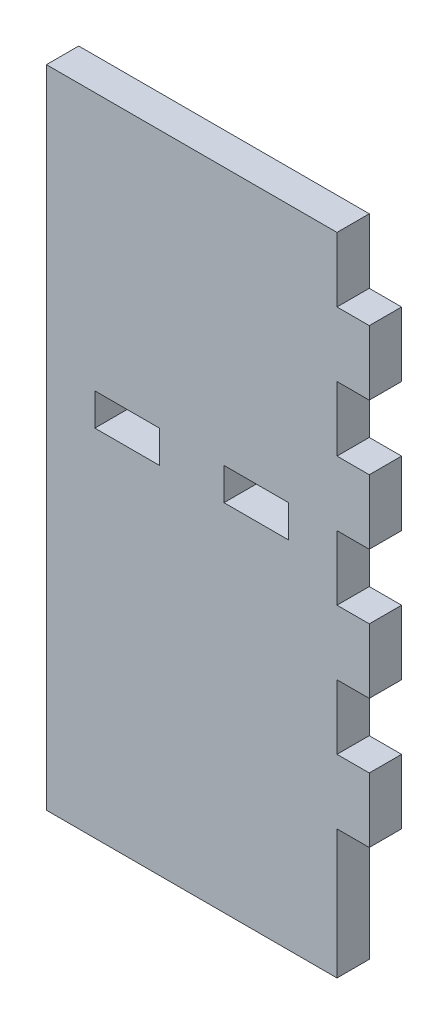
ISO-10303-21;
HEADER;
FILE_DESCRIPTION(('STEP AP214'),'2;1');
FILE_NAME('part.step','',(''),(''),'','','');
FILE_SCHEMA(('AUTOMOTIVE_DESIGN { 1 0 10303 214 1 1 1 1 }'));
ENDSEC;
DATA;
#1=APPLICATION_CONTEXT('core data for automotive mechanical design processes');
#2=APPLICATION_PROTOCOL_DEFINITION('international standard','automotive_design',2000,#1);
#3=PRODUCT_CONTEXT('',#1,'mechanical');
#4=PRODUCT('Part','Part','',(#3));
#5=PRODUCT_RELATED_PRODUCT_CATEGORY('part','',(#4));
#6=PRODUCT_DEFINITION_FORMATION('','',#4);
#7=PRODUCT_DEFINITION_CONTEXT('part definition',#1,'design');
#8=PRODUCT_DEFINITION('design','',#6,#7);
#9=PRODUCT_DEFINITION_SHAPE('','',#8);
#10=(LENGTH_UNIT() NAMED_UNIT(*) SI_UNIT(.MILLI.,.METRE.));
#11=(NAMED_UNIT(*) PLANE_ANGLE_UNIT() SI_UNIT($,.RADIAN.));
#12=(NAMED_UNIT(*) SI_UNIT($,.STERADIAN.) SOLID_ANGLE_UNIT());
#13=UNCERTAINTY_MEASURE_WITH_UNIT(LENGTH_MEASURE(1.E-05),#10,'distance_accuracy_value','');
#14=(GEOMETRIC_REPRESENTATION_CONTEXT(3) GLOBAL_UNCERTAINTY_ASSIGNED_CONTEXT((#13)) GLOBAL_UNIT_ASSIGNED_CONTEXT((#10,
#11,#12)) REPRESENTATION_CONTEXT('',''));
#15=CARTESIAN_POINT('',(0.,0.,0.));
#16=DIRECTION('',(0.,0.,1.));
#17=DIRECTION('',(1.,0.,0.));
#18=AXIS2_PLACEMENT_3D('',#15,#16,#17);
#19=CARTESIAN_POINT('',(28.575,63.5,6.35));
#20=DIRECTION('',(-1.,0.,0.));
#21=DIRECTION('',(0.,-1.,0.));
#22=AXIS2_PLACEMENT_3D('',#19,#20,#21);
#23=PLANE('',#22);
#24=DIRECTION('',(0.,1.,0.));
#25=VECTOR('',#24,1.);
#26=CARTESIAN_POINT('',(28.575,63.5,6.35));
#27=LINE('',#26,#25);
#28=CARTESIAN_POINT('',(28.575,-25.4,6.35));
#29=VERTEX_POINT('',#28);
#30=CARTESIAN_POINT('',(28.575,-12.7,6.35));
#31=VERTEX_POINT('',#30);
#32=EDGE_CURVE('E474',#29,#31,#27,.T.);
#33=ORIENTED_EDGE('',*,*,#32,.F.);
#34=DIRECTION('',(0.,0.,1.));
#35=VECTOR('',#34,1.);
#36=CARTESIAN_POINT('',(28.575,-25.4,0.));
#37=LINE('',#36,#35);
#38=CARTESIAN_POINT('',(28.575,-25.4,0.));
#39=VERTEX_POINT('',#38);
#40=EDGE_CURVE('E344',#39,#29,#37,.T.);
#41=ORIENTED_EDGE('',*,*,#40,.F.);
#42=DIRECTION('',(0.,1.,0.));
#43=VECTOR('',#42,1.);
#44=CARTESIAN_POINT('',(28.575,63.5,0.));
#45=LINE('',#44,#43);
#46=CARTESIAN_POINT('',(28.575,-12.7,0.));
#47=VERTEX_POINT('',#46);
#48=EDGE_CURVE('E489',#39,#47,#45,.T.);
#49=ORIENTED_EDGE('',*,*,#48,.T.);
#50=DIRECTION('',(0.,0.,1.));
#51=VECTOR('',#50,1.);
#52=CARTESIAN_POINT('',(28.575,-12.7,0.));
#53=LINE('',#52,#51);
#54=EDGE_CURVE('E370',#47,#31,#53,.T.);
#55=ORIENTED_EDGE('',*,*,#54,.T.);
#56=EDGE_LOOP('',(#33,#41,#49,#55));
#57=FACE_BOUND('',#56,.T.);
#58=ADVANCED_FACE('F41',(#57),#23,.F.);
#59=CARTESIAN_POINT('',(28.575,0.,6.35));
#60=VERTEX_POINT('',#59);
#61=CARTESIAN_POINT('',(28.575,12.7,6.35));
#62=VERTEX_POINT('',#61);
#63=EDGE_CURVE('E545',#60,#62,#27,.T.);
#64=ORIENTED_EDGE('',*,*,#63,.F.);
#65=DIRECTION('',(0.,0.,1.));
#66=VECTOR('',#65,1.);
#67=CARTESIAN_POINT('',(28.575,0.,0.));
#68=LINE('',#67,#66);
#69=CARTESIAN_POINT('',(28.575,0.,0.));
#70=VERTEX_POINT('',#69);
#71=EDGE_CURVE('E381',#70,#60,#68,.T.);
#72=ORIENTED_EDGE('',*,*,#71,.F.);
#73=CARTESIAN_POINT('',(28.575,12.7,0.));
#74=VERTEX_POINT('',#73);
#75=EDGE_CURVE('E562',#70,#74,#45,.T.);
#76=ORIENTED_EDGE('',*,*,#75,.T.);
#77=DIRECTION('',(0.,0.,1.));
#78=VECTOR('',#77,1.);
#79=CARTESIAN_POINT('',(28.575,12.7,0.));
#80=LINE('',#79,#78);
#81=EDGE_CURVE('E408',#74,#62,#80,.T.);
#82=ORIENTED_EDGE('',*,*,#81,.T.);
#83=EDGE_LOOP('',(#64,#72,#76,#82));
#84=FACE_BOUND('',#83,.T.);
#85=ADVANCED_FACE('F571',(#84),#23,.F.);
#86=CARTESIAN_POINT('',(28.575,25.4,6.35));
#87=VERTEX_POINT('',#86);
#88=CARTESIAN_POINT('',(28.575,38.1,6.35));
#89=VERTEX_POINT('',#88);
#90=EDGE_CURVE('E547',#87,#89,#27,.T.);
#91=ORIENTED_EDGE('',*,*,#90,.F.);
#92=DIRECTION('',(0.,0.,1.));
#93=VECTOR('',#92,1.);
#94=CARTESIAN_POINT('',(28.575,25.4,0.));
#95=LINE('',#94,#93);
#96=CARTESIAN_POINT('',(28.575,25.4,0.));
#97=VERTEX_POINT('',#96);
#98=EDGE_CURVE('E419',#97,#87,#95,.T.);
#99=ORIENTED_EDGE('',*,*,#98,.F.);
#100=CARTESIAN_POINT('',(28.575,38.1,0.));
#101=VERTEX_POINT('',#100);
#102=EDGE_CURVE('E560',#97,#101,#45,.T.);
#103=ORIENTED_EDGE('',*,*,#102,.T.);
#104=DIRECTION('',(0.,0.,1.));
#105=VECTOR('',#104,1.);
#106=CARTESIAN_POINT('',(28.575,38.1,0.));
#107=LINE('',#106,#105);
#108=EDGE_CURVE('E445',#101,#89,#107,.T.);
#109=ORIENTED_EDGE('',*,*,#108,.T.);
#110=EDGE_LOOP('',(#91,#99,#103,#109));
#111=FACE_BOUND('',#110,.T.);
#112=ADVANCED_FACE('F585',(#111),#23,.F.);
#113=DIRECTION('',(0.,0.,1.));
#114=VECTOR('',#113,1.);
#115=CARTESIAN_POINT('',(28.575,50.8,0.));
#116=LINE('',#115,#114);
#117=CARTESIAN_POINT('',(28.575,50.8,0.));
#118=VERTEX_POINT('',#117);
#119=CARTESIAN_POINT('',(28.575,50.8,6.35));
#120=VERTEX_POINT('',#119);
#121=EDGE_CURVE('E456',#118,#120,#116,.T.);
#122=ORIENTED_EDGE('',*,*,#121,.F.);
#123=CARTESIAN_POINT('',(28.575,63.5,0.));
#124=VERTEX_POINT('',#123);
#125=EDGE_CURVE('E459',#118,#124,#45,.T.);
#126=ORIENTED_EDGE('',*,*,#125,.T.);
#127=DIRECTION('',(0.,0.,-1.));
#128=VECTOR('',#127,1.);
#129=CARTESIAN_POINT('',(28.575,63.5,6.35));
#130=LINE('',#129,#128);
#131=CARTESIAN_POINT('',(28.575,63.5,6.35));
#132=VERTEX_POINT('',#131);
#133=EDGE_CURVE('E11',#132,#124,#130,.T.);
#134=ORIENTED_EDGE('',*,*,#133,.F.);
#135=EDGE_CURVE('E475',#120,#132,#27,.T.);
#136=ORIENTED_EDGE('',*,*,#135,.F.);
#137=EDGE_LOOP('',(#122,#126,#134,#136));
#138=FACE_BOUND('',#137,.T.);
#139=ADVANCED_FACE('F557',(#138),#23,.F.);
#140=CARTESIAN_POINT('',(28.575,-63.5,0.));
#141=VERTEX_POINT('',#140);
#142=CARTESIAN_POINT('',(28.575,-38.1,0.));
#143=VERTEX_POINT('',#142);
#144=EDGE_CURVE('E485',#141,#143,#45,.T.);
#145=ORIENTED_EDGE('',*,*,#144,.T.);
#146=DIRECTION('',(0.,0.,1.));
#147=VECTOR('',#146,1.);
#148=CARTESIAN_POINT('',(28.575,-38.1,0.));
#149=LINE('',#148,#147);
#150=CARTESIAN_POINT('',(28.575,-38.1,6.35));
#151=VERTEX_POINT('',#150);
#152=EDGE_CURVE('E333',#143,#151,#149,.T.);
#153=ORIENTED_EDGE('',*,*,#152,.T.);
#154=CARTESIAN_POINT('',(28.575,-63.5,6.35));
#155=VERTEX_POINT('',#154);
#156=EDGE_CURVE('E469',#155,#151,#27,.T.);
#157=ORIENTED_EDGE('',*,*,#156,.F.);
#158=DIRECTION('',(0.,0.,-1.));
#159=VECTOR('',#158,1.);
#160=CARTESIAN_POINT('',(28.575,-63.5,6.35));
#161=LINE('',#160,#159);
#162=EDGE_CURVE('E484',#155,#141,#161,.T.);
#163=ORIENTED_EDGE('',*,*,#162,.T.);
#164=EDGE_LOOP('',(#145,#153,#157,#163));
#165=FACE_BOUND('',#164,.T.);
#166=ADVANCED_FACE('F43',(#165),#23,.F.);
#167=CARTESIAN_POINT('',(-28.575,63.5,6.35));
#168=DIRECTION('',(0.,-1.,0.));
#169=DIRECTION('',(0.,0.,-1.));
#170=AXIS2_PLACEMENT_3D('',#167,#168,#169);
#171=PLANE('',#170);
#172=DIRECTION('',(-1.,0.,0.));
#173=VECTOR('',#172,1.);
#174=CARTESIAN_POINT('',(-28.575,63.5,0.));
#175=LINE('',#174,#173);
#176=CARTESIAN_POINT('',(-28.575,63.5,0.));
#177=VERTEX_POINT('',#176);
#178=EDGE_CURVE('E488',#124,#177,#175,.T.);
#179=ORIENTED_EDGE('',*,*,#178,.T.);
#180=DIRECTION('',(0.,0.,-1.));
#181=VECTOR('',#180,1.);
#182=CARTESIAN_POINT('',(-28.575,63.5,6.35));
#183=LINE('',#182,#181);
#184=CARTESIAN_POINT('',(-28.575,63.5,6.35));
#185=VERTEX_POINT('',#184);
#186=EDGE_CURVE('E50',#185,#177,#183,.T.);
#187=ORIENTED_EDGE('',*,*,#186,.F.);
#188=DIRECTION('',(-1.,0.,0.));
#189=VECTOR('',#188,1.);
#190=CARTESIAN_POINT('',(-28.575,63.5,6.35));
#191=LINE('',#190,#189);
#192=EDGE_CURVE('E473',#132,#185,#191,.T.);
#193=ORIENTED_EDGE('',*,*,#192,.F.);
#194=ORIENTED_EDGE('',*,*,#133,.T.);
#195=EDGE_LOOP('',(#179,#187,#193,#194));
#196=FACE_BOUND('',#195,.T.);
#197=ADVANCED_FACE('F556',(#196),#171,.F.);
#198=CARTESIAN_POINT('',(-28.575,63.5,6.35));
#199=DIRECTION('',(1.,0.,0.));
#200=DIRECTION('',(0.,1.,0.));
#201=AXIS2_PLACEMENT_3D('',#198,#199,#200);
#202=PLANE('',#201);
#203=DIRECTION('',(0.,-1.,0.));
#204=VECTOR('',#203,1.);
#205=CARTESIAN_POINT('',(-28.575,63.5,0.));
#206=LINE('',#205,#204);
#207=CARTESIAN_POINT('',(-28.575,-63.5,0.));
#208=VERTEX_POINT('',#207);
#209=EDGE_CURVE('E492',#177,#208,#206,.T.);
#210=ORIENTED_EDGE('',*,*,#209,.T.);
#211=DIRECTION('',(0.,0.,-1.));
#212=VECTOR('',#211,1.);
#213=CARTESIAN_POINT('',(-28.575,-63.5,6.35));
#214=LINE('',#213,#212);
#215=CARTESIAN_POINT('',(-28.575,-63.5,6.35));
#216=VERTEX_POINT('',#215);
#217=EDGE_CURVE('E501',#216,#208,#214,.T.);
#218=ORIENTED_EDGE('',*,*,#217,.F.);
#219=DIRECTION('',(0.,-1.,0.));
#220=VECTOR('',#219,1.);
#221=CARTESIAN_POINT('',(-28.575,63.5,6.35));
#222=LINE('',#221,#220);
#223=EDGE_CURVE('E478',#185,#216,#222,.T.);
#224=ORIENTED_EDGE('',*,*,#223,.F.);
#225=ORIENTED_EDGE('',*,*,#186,.T.);
#226=EDGE_LOOP('',(#210,#218,#224,#225));
#227=FACE_BOUND('',#226,.T.);
#228=ADVANCED_FACE('F510',(#227),#202,.F.);
#229=CARTESIAN_POINT('',(-28.575,-63.5,6.35));
#230=DIRECTION('',(0.,1.,0.));
#231=DIRECTION('',(0.,0.,1.));
#232=AXIS2_PLACEMENT_3D('',#229,#230,#231);
#233=PLANE('',#232);
#234=DIRECTION('',(1.,0.,0.));
#235=VECTOR('',#234,1.);
#236=CARTESIAN_POINT('',(-28.575,-63.5,0.));
#237=LINE('',#236,#235);
#238=EDGE_CURVE('E495',#208,#141,#237,.T.);
#239=ORIENTED_EDGE('',*,*,#238,.T.);
#240=ORIENTED_EDGE('',*,*,#162,.F.);
#241=DIRECTION('',(1.,0.,0.));
#242=VECTOR('',#241,1.);
#243=CARTESIAN_POINT('',(-28.575,-63.5,6.35));
#244=LINE('',#243,#242);
#245=EDGE_CURVE('E481',#216,#155,#244,.T.);
#246=ORIENTED_EDGE('',*,*,#245,.F.);
#247=ORIENTED_EDGE('',*,*,#217,.T.);
#248=EDGE_LOOP('',(#239,#240,#246,#247));
#249=FACE_BOUND('',#248,.T.);
#250=ADVANCED_FACE('F522',(#249),#233,.F.);
#251=CARTESIAN_POINT('',(0.,0.,6.35));
#252=DIRECTION('',(0.,0.,1.));
#253=DIRECTION('',(1.,0.,0.));
#254=AXIS2_PLACEMENT_3D('',#251,#252,#253);
#255=PLANE('',#254);
#256=DIRECTION('',(0.,-1.,0.));
#257=VECTOR('',#256,1.);
#258=CARTESIAN_POINT('',(6.34999999999999,12.7,6.35));
#259=LINE('',#258,#257);
#260=CARTESIAN_POINT('',(6.34999999999999,12.7,6.35));
#261=VERTEX_POINT('',#260);
#262=CARTESIAN_POINT('',(6.34999999999999,6.34999999999999,6.35));
#263=VERTEX_POINT('',#262);
#264=EDGE_CURVE('E57',#261,#263,#259,.T.);
#265=ORIENTED_EDGE('',*,*,#264,.F.);
#266=DIRECTION('',(-1.,0.,0.));
#267=VECTOR('',#266,1.);
#268=CARTESIAN_POINT('',(6.34999999999999,12.7,6.35));
#269=LINE('',#268,#267);
#270=CARTESIAN_POINT('',(19.05,12.7,6.35));
#271=VERTEX_POINT('',#270);
#272=EDGE_CURVE('E248',#271,#261,#269,.T.);
#273=ORIENTED_EDGE('',*,*,#272,.F.);
#274=DIRECTION('',(0.,1.,0.));
#275=VECTOR('',#274,1.);
#276=CARTESIAN_POINT('',(19.05,12.7,6.35));
#277=LINE('',#276,#275);
#278=CARTESIAN_POINT('',(19.05,6.34999999999999,6.35));
#279=VERTEX_POINT('',#278);
#280=EDGE_CURVE('E252',#279,#271,#277,.T.);
#281=ORIENTED_EDGE('',*,*,#280,.F.);
#282=DIRECTION('',(1.,0.,0.));
#283=VECTOR('',#282,1.);
#284=CARTESIAN_POINT('',(6.34999999999999,6.34999999999999,6.35));
#285=LINE('',#284,#283);
#286=EDGE_CURVE('E261',#263,#279,#285,.T.);
#287=ORIENTED_EDGE('',*,*,#286,.F.);
#288=EDGE_LOOP('',(#265,#273,#281,#287));
#289=FACE_BOUND('',#288,.T.);
#290=DIRECTION('',(0.,-1.,0.));
#291=VECTOR('',#290,1.);
#292=CARTESIAN_POINT('',(-19.05,12.7,6.35));
#293=LINE('',#292,#291);
#294=CARTESIAN_POINT('',(-19.05,12.7,6.35));
#295=VERTEX_POINT('',#294);
#296=CARTESIAN_POINT('',(-19.05,6.34999999999999,6.35));
#297=VERTEX_POINT('',#296);
#298=EDGE_CURVE('E270',#295,#297,#293,.T.);
#299=ORIENTED_EDGE('',*,*,#298,.F.);
#300=DIRECTION('',(-1.,0.,0.));
#301=VECTOR('',#300,1.);
#302=CARTESIAN_POINT('',(-19.05,12.7,6.35));
#303=LINE('',#302,#301);
#304=CARTESIAN_POINT('',(-6.35000000000001,12.7,6.35));
#305=VERTEX_POINT('',#304);
#306=EDGE_CURVE('E281',#305,#295,#303,.T.);
#307=ORIENTED_EDGE('',*,*,#306,.F.);
#308=DIRECTION('',(0.,1.,0.));
#309=VECTOR('',#308,1.);
#310=CARTESIAN_POINT('',(-6.35000000000001,12.7,6.35));
#311=LINE('',#310,#309);
#312=CARTESIAN_POINT('',(-6.35000000000001,6.34999999999999,6.35));
#313=VERTEX_POINT('',#312);
#314=EDGE_CURVE('E300',#313,#305,#311,.T.);
#315=ORIENTED_EDGE('',*,*,#314,.F.);
#316=DIRECTION('',(1.,0.,0.));
#317=VECTOR('',#316,1.);
#318=CARTESIAN_POINT('',(-19.05,6.34999999999999,6.35));
#319=LINE('',#318,#317);
#320=EDGE_CURVE('E296',#297,#313,#319,.T.);
#321=ORIENTED_EDGE('',*,*,#320,.F.);
#322=EDGE_LOOP('',(#299,#307,#315,#321));
#323=FACE_BOUND('',#322,.T.);
#324=ORIENTED_EDGE('',*,*,#156,.T.);
#325=DIRECTION('',(1.,0.,0.));
#326=VECTOR('',#325,1.);
#327=CARTESIAN_POINT('',(28.575,-38.1,6.35));
#328=LINE('',#327,#326);
#329=CARTESIAN_POINT('',(34.925,-38.1,6.35));
#330=VERTEX_POINT('',#329);
#331=EDGE_CURVE('E310',#151,#330,#328,.T.);
#332=ORIENTED_EDGE('',*,*,#331,.T.);
#333=DIRECTION('',(0.,1.,0.));
#334=VECTOR('',#333,1.);
#335=CARTESIAN_POINT('',(34.925,-25.4,6.35));
#336=LINE('',#335,#334);
#337=CARTESIAN_POINT('',(34.925,-25.4,6.35));
#338=VERTEX_POINT('',#337);
#339=EDGE_CURVE('E337',#330,#338,#336,.T.);
#340=ORIENTED_EDGE('',*,*,#339,.T.);
#341=DIRECTION('',(-1.,0.,0.));
#342=VECTOR('',#341,1.);
#343=CARTESIAN_POINT('',(28.575,-25.4,6.35));
#344=LINE('',#343,#342);
#345=EDGE_CURVE('E325',#338,#29,#344,.T.);
#346=ORIENTED_EDGE('',*,*,#345,.T.);
#347=ORIENTED_EDGE('',*,*,#32,.T.);
#348=DIRECTION('',(1.,0.,0.));
#349=VECTOR('',#348,1.);
#350=CARTESIAN_POINT('',(28.575,-12.7,6.35));
#351=LINE('',#350,#349);
#352=CARTESIAN_POINT('',(34.925,-12.7,6.35));
#353=VERTEX_POINT('',#352);
#354=EDGE_CURVE('E348',#31,#353,#351,.T.);
#355=ORIENTED_EDGE('',*,*,#354,.T.);
#356=DIRECTION('',(0.,1.,0.));
#357=VECTOR('',#356,1.);
#358=CARTESIAN_POINT('',(34.925,0.,6.35));
#359=LINE('',#358,#357);
#360=CARTESIAN_POINT('',(34.925,0.,6.35));
#361=VERTEX_POINT('',#360);
#362=EDGE_CURVE('E374',#353,#361,#359,.T.);
#363=ORIENTED_EDGE('',*,*,#362,.T.);
#364=DIRECTION('',(-1.,0.,0.));
#365=VECTOR('',#364,1.);
#366=CARTESIAN_POINT('',(28.575,0.,6.35));
#367=LINE('',#366,#365);
#368=EDGE_CURVE('E362',#361,#60,#367,.T.);
#369=ORIENTED_EDGE('',*,*,#368,.T.);
#370=ORIENTED_EDGE('',*,*,#63,.T.);
#371=DIRECTION('',(1.,0.,0.));
#372=VECTOR('',#371,1.);
#373=CARTESIAN_POINT('',(28.575,12.7,6.35));
#374=LINE('',#373,#372);
#375=CARTESIAN_POINT('',(34.925,12.7,6.35));
#376=VERTEX_POINT('',#375);
#377=EDGE_CURVE('E385',#62,#376,#374,.T.);
#378=ORIENTED_EDGE('',*,*,#377,.T.);
#379=DIRECTION('',(0.,1.,0.));
#380=VECTOR('',#379,1.);
#381=CARTESIAN_POINT('',(34.925,25.4,6.35));
#382=LINE('',#381,#380);
#383=CARTESIAN_POINT('',(34.925,25.4,6.35));
#384=VERTEX_POINT('',#383);
#385=EDGE_CURVE('E412',#376,#384,#382,.T.);
#386=ORIENTED_EDGE('',*,*,#385,.T.);
#387=DIRECTION('',(-1.,0.,0.));
#388=VECTOR('',#387,1.);
#389=CARTESIAN_POINT('',(28.575,25.4,6.35));
#390=LINE('',#389,#388);
#391=EDGE_CURVE('E400',#384,#87,#390,.T.);
#392=ORIENTED_EDGE('',*,*,#391,.T.);
#393=ORIENTED_EDGE('',*,*,#90,.T.);
#394=DIRECTION('',(1.,0.,0.));
#395=VECTOR('',#394,1.);
#396=CARTESIAN_POINT('',(28.575,38.1,6.35));
#397=LINE('',#396,#395);
#398=CARTESIAN_POINT('',(34.925,38.1,6.35));
#399=VERTEX_POINT('',#398);
#400=EDGE_CURVE('E423',#89,#399,#397,.T.);
#401=ORIENTED_EDGE('',*,*,#400,.T.);
#402=DIRECTION('',(0.,1.,0.));
#403=VECTOR('',#402,1.);
#404=CARTESIAN_POINT('',(34.925,50.8,6.35));
#405=LINE('',#404,#403);
#406=CARTESIAN_POINT('',(34.925,50.8,6.35));
#407=VERTEX_POINT('',#406);
#408=EDGE_CURVE('E449',#399,#407,#405,.T.);
#409=ORIENTED_EDGE('',*,*,#408,.T.);
#410=DIRECTION('',(-1.,0.,0.));
#411=VECTOR('',#410,1.);
#412=CARTESIAN_POINT('',(28.575,50.8,6.35));
#413=LINE('',#412,#411);
#414=EDGE_CURVE('E438',#407,#120,#413,.T.);
#415=ORIENTED_EDGE('',*,*,#414,.T.);
#416=ORIENTED_EDGE('',*,*,#135,.T.);
#417=ORIENTED_EDGE('',*,*,#192,.T.);
#418=ORIENTED_EDGE('',*,*,#223,.T.);
#419=ORIENTED_EDGE('',*,*,#245,.T.);
#420=EDGE_LOOP('',(#324,#332,#340,#346,#347,#355,#363,#369,#370,#378,#386,#392,#393,#401,#409,
#415,#416,#417,#418,#419));
#421=FACE_BOUND('',#420,.T.);
#422=ADVANCED_FACE('F529',(#289,#323,#421),#255,.T.);
#423=CARTESIAN_POINT('',(0.,0.,0.));
#424=DIRECTION('',(0.,0.,1.));
#425=DIRECTION('',(1.,0.,0.));
#426=AXIS2_PLACEMENT_3D('',#423,#424,#425);
#427=PLANE('',#426);
#428=DIRECTION('',(-1.,0.,0.));
#429=VECTOR('',#428,1.);
#430=CARTESIAN_POINT('',(6.34999999999999,12.7,0.));
#431=LINE('',#430,#429);
#432=CARTESIAN_POINT('',(19.05,12.7,0.));
#433=VERTEX_POINT('',#432);
#434=CARTESIAN_POINT('',(6.34999999999999,12.7,0.));
#435=VERTEX_POINT('',#434);
#436=EDGE_CURVE('E236',#433,#435,#431,.T.);
#437=ORIENTED_EDGE('',*,*,#436,.T.);
#438=DIRECTION('',(0.,-1.,0.));
#439=VECTOR('',#438,1.);
#440=CARTESIAN_POINT('',(6.34999999999999,12.7,0.));
#441=LINE('',#440,#439);
#442=CARTESIAN_POINT('',(6.34999999999999,6.34999999999999,0.));
#443=VERTEX_POINT('',#442);
#444=EDGE_CURVE('E229',#435,#443,#441,.T.);
#445=ORIENTED_EDGE('',*,*,#444,.T.);
#446=DIRECTION('',(1.,0.,0.));
#447=VECTOR('',#446,1.);
#448=CARTESIAN_POINT('',(6.34999999999999,6.34999999999999,0.));
#449=LINE('',#448,#447);
#450=CARTESIAN_POINT('',(19.05,6.34999999999999,0.));
#451=VERTEX_POINT('',#450);
#452=EDGE_CURVE('E239',#443,#451,#449,.T.);
#453=ORIENTED_EDGE('',*,*,#452,.T.);
#454=DIRECTION('',(0.,1.,0.));
#455=VECTOR('',#454,1.);
#456=CARTESIAN_POINT('',(19.05,12.7,0.));
#457=LINE('',#456,#455);
#458=EDGE_CURVE('E65',#451,#433,#457,.T.);
#459=ORIENTED_EDGE('',*,*,#458,.T.);
#460=EDGE_LOOP('',(#437,#445,#453,#459));
#461=FACE_BOUND('',#460,.T.);
#462=DIRECTION('',(-1.,0.,0.));
#463=VECTOR('',#462,1.);
#464=CARTESIAN_POINT('',(-19.05,12.7,0.));
#465=LINE('',#464,#463);
#466=CARTESIAN_POINT('',(-6.35000000000001,12.7,0.));
#467=VERTEX_POINT('',#466);
#468=CARTESIAN_POINT('',(-19.05,12.7,0.));
#469=VERTEX_POINT('',#468);
#470=EDGE_CURVE('E289',#467,#469,#465,.T.);
#471=ORIENTED_EDGE('',*,*,#470,.T.);
#472=DIRECTION('',(0.,-1.,0.));
#473=VECTOR('',#472,1.);
#474=CARTESIAN_POINT('',(-19.05,12.7,0.));
#475=LINE('',#474,#473);
#476=CARTESIAN_POINT('',(-19.05,6.34999999999999,0.));
#477=VERTEX_POINT('',#476);
#478=EDGE_CURVE('E276',#469,#477,#475,.T.);
#479=ORIENTED_EDGE('',*,*,#478,.T.);
#480=DIRECTION('',(1.,0.,0.));
#481=VECTOR('',#480,1.);
#482=CARTESIAN_POINT('',(-19.05,6.34999999999999,0.));
#483=LINE('',#482,#481);
#484=CARTESIAN_POINT('',(-6.35000000000001,6.34999999999999,0.));
#485=VERTEX_POINT('',#484);
#486=EDGE_CURVE('E280',#477,#485,#483,.T.);
#487=ORIENTED_EDGE('',*,*,#486,.T.);
#488=DIRECTION('',(0.,1.,0.));
#489=VECTOR('',#488,1.);
#490=CARTESIAN_POINT('',(-6.35000000000001,12.7,0.));
#491=LINE('',#490,#489);
#492=EDGE_CURVE('E285',#485,#467,#491,.T.);
#493=ORIENTED_EDGE('',*,*,#492,.T.);
#494=EDGE_LOOP('',(#471,#479,#487,#493));
#495=FACE_BOUND('',#494,.T.);
#496=ORIENTED_EDGE('',*,*,#144,.F.);
#497=ORIENTED_EDGE('',*,*,#238,.F.);
#498=ORIENTED_EDGE('',*,*,#209,.F.);
#499=ORIENTED_EDGE('',*,*,#178,.F.);
#500=ORIENTED_EDGE('',*,*,#125,.F.);
#501=DIRECTION('',(-1.,0.,0.));
#502=VECTOR('',#501,1.);
#503=CARTESIAN_POINT('',(28.575,50.8,0.));
#504=LINE('',#503,#502);
#505=CARTESIAN_POINT('',(34.925,50.8,0.));
#506=VERTEX_POINT('',#505);
#507=EDGE_CURVE('E442',#506,#118,#504,.T.);
#508=ORIENTED_EDGE('',*,*,#507,.F.);
#509=DIRECTION('',(0.,1.,0.));
#510=VECTOR('',#509,1.);
#511=CARTESIAN_POINT('',(34.925,50.8,0.));
#512=LINE('',#511,#510);
#513=CARTESIAN_POINT('',(34.925,38.1,0.));
#514=VERTEX_POINT('',#513);
#515=EDGE_CURVE('E437',#514,#506,#512,.T.);
#516=ORIENTED_EDGE('',*,*,#515,.F.);
#517=DIRECTION('',(1.,0.,0.));
#518=VECTOR('',#517,1.);
#519=CARTESIAN_POINT('',(28.575,38.1,0.));
#520=LINE('',#519,#518);
#521=EDGE_CURVE('E433',#101,#514,#520,.T.);
#522=ORIENTED_EDGE('',*,*,#521,.F.);
#523=ORIENTED_EDGE('',*,*,#102,.F.);
#524=DIRECTION('',(-1.,0.,0.));
#525=VECTOR('',#524,1.);
#526=CARTESIAN_POINT('',(28.575,25.4,0.));
#527=LINE('',#526,#525);
#528=CARTESIAN_POINT('',(34.925,25.4,0.));
#529=VERTEX_POINT('',#528);
#530=EDGE_CURVE('E404',#529,#97,#527,.T.);
#531=ORIENTED_EDGE('',*,*,#530,.F.);
#532=DIRECTION('',(0.,1.,0.));
#533=VECTOR('',#532,1.);
#534=CARTESIAN_POINT('',(34.925,25.4,0.));
#535=LINE('',#534,#533);
#536=CARTESIAN_POINT('',(34.925,12.7,0.));
#537=VERTEX_POINT('',#536);
#538=EDGE_CURVE('E399',#537,#529,#535,.T.);
#539=ORIENTED_EDGE('',*,*,#538,.F.);
#540=DIRECTION('',(1.,0.,0.));
#541=VECTOR('',#540,1.);
#542=CARTESIAN_POINT('',(28.575,12.7,0.));
#543=LINE('',#542,#541);
#544=EDGE_CURVE('E395',#74,#537,#543,.T.);
#545=ORIENTED_EDGE('',*,*,#544,.F.);
#546=ORIENTED_EDGE('',*,*,#75,.F.);
#547=DIRECTION('',(-1.,0.,0.));
#548=VECTOR('',#547,1.);
#549=CARTESIAN_POINT('',(28.575,0.,0.));
#550=LINE('',#549,#548);
#551=CARTESIAN_POINT('',(34.925,0.,0.));
#552=VERTEX_POINT('',#551);
#553=EDGE_CURVE('E366',#552,#70,#550,.T.);
#554=ORIENTED_EDGE('',*,*,#553,.F.);
#555=DIRECTION('',(0.,1.,0.));
#556=VECTOR('',#555,1.);
#557=CARTESIAN_POINT('',(34.925,0.,0.));
#558=LINE('',#557,#556);
#559=CARTESIAN_POINT('',(34.925,-12.7,0.));
#560=VERTEX_POINT('',#559);
#561=EDGE_CURVE('E361',#560,#552,#558,.T.);
#562=ORIENTED_EDGE('',*,*,#561,.F.);
#563=DIRECTION('',(1.,0.,0.));
#564=VECTOR('',#563,1.);
#565=CARTESIAN_POINT('',(28.575,-12.7,0.));
#566=LINE('',#565,#564);
#567=EDGE_CURVE('E357',#47,#560,#566,.T.);
#568=ORIENTED_EDGE('',*,*,#567,.F.);
#569=ORIENTED_EDGE('',*,*,#48,.F.);
#570=DIRECTION('',(-1.,0.,0.));
#571=VECTOR('',#570,1.);
#572=CARTESIAN_POINT('',(28.575,-25.4,0.));
#573=LINE('',#572,#571);
#574=CARTESIAN_POINT('',(34.925,-25.4,0.));
#575=VERTEX_POINT('',#574);
#576=EDGE_CURVE('E329',#575,#39,#573,.T.);
#577=ORIENTED_EDGE('',*,*,#576,.F.);
#578=DIRECTION('',(0.,1.,0.));
#579=VECTOR('',#578,1.);
#580=CARTESIAN_POINT('',(34.925,-25.4,0.));
#581=LINE('',#580,#579);
#582=CARTESIAN_POINT('',(34.925,-38.1,0.));
#583=VERTEX_POINT('',#582);
#584=EDGE_CURVE('E324',#583,#575,#581,.T.);
#585=ORIENTED_EDGE('',*,*,#584,.F.);
#586=DIRECTION('',(1.,0.,0.));
#587=VECTOR('',#586,1.);
#588=CARTESIAN_POINT('',(28.575,-38.1,0.));
#589=LINE('',#588,#587);
#590=EDGE_CURVE('E320',#143,#583,#589,.T.);
#591=ORIENTED_EDGE('',*,*,#590,.F.);
#592=EDGE_LOOP('',(#496,#497,#498,#499,#500,#508,#516,#522,#523,#531,#539,#545,#546,#554,#562,
#568,#569,#577,#585,#591));
#593=FACE_BOUND('',#592,.T.);
#594=ADVANCED_FACE('F244',(#461,#495,#593),#427,.F.);
#595=CARTESIAN_POINT('',(28.575,50.8,0.));
#596=DIRECTION('',(0.,1.,0.));
#597=DIRECTION('',(-1.,0.,0.));
#598=AXIS2_PLACEMENT_3D('',#595,#596,#597);
#599=PLANE('',#598);
#600=ORIENTED_EDGE('',*,*,#414,.F.);
#601=DIRECTION('',(0.,0.,1.));
#602=VECTOR('',#601,1.);
#603=CARTESIAN_POINT('',(34.925,50.8,0.));
#604=LINE('',#603,#602);
#605=EDGE_CURVE('E460',#506,#407,#604,.T.);
#606=ORIENTED_EDGE('',*,*,#605,.F.);
#607=ORIENTED_EDGE('',*,*,#507,.T.);
#608=ORIENTED_EDGE('',*,*,#121,.T.);
#609=EDGE_LOOP('',(#600,#606,#607,#608));
#610=FACE_BOUND('',#609,.T.);
#611=ADVANCED_FACE('F594',(#610),#599,.T.);
#612=CARTESIAN_POINT('',(34.925,50.8,0.));
#613=DIRECTION('',(1.,0.,0.));
#614=DIRECTION('',(0.,0.,-1.));
#615=AXIS2_PLACEMENT_3D('',#612,#613,#614);
#616=PLANE('',#615);
#617=ORIENTED_EDGE('',*,*,#408,.F.);
#618=DIRECTION('',(0.,0.,1.));
#619=VECTOR('',#618,1.);
#620=CARTESIAN_POINT('',(34.925,38.1,0.));
#621=LINE('',#620,#619);
#622=EDGE_CURVE('E463',#514,#399,#621,.T.);
#623=ORIENTED_EDGE('',*,*,#622,.F.);
#624=ORIENTED_EDGE('',*,*,#515,.T.);
#625=ORIENTED_EDGE('',*,*,#605,.T.);
#626=EDGE_LOOP('',(#617,#623,#624,#625));
#627=FACE_BOUND('',#626,.T.);
#628=ADVANCED_FACE('F592',(#627),#616,.T.);
#629=CARTESIAN_POINT('',(28.575,38.1,0.));
#630=DIRECTION('',(0.,-1.,0.));
#631=DIRECTION('',(0.,0.,-1.));
#632=AXIS2_PLACEMENT_3D('',#629,#630,#631);
#633=PLANE('',#632);
#634=ORIENTED_EDGE('',*,*,#400,.F.);
#635=ORIENTED_EDGE('',*,*,#108,.F.);
#636=ORIENTED_EDGE('',*,*,#521,.T.);
#637=ORIENTED_EDGE('',*,*,#622,.T.);
#638=EDGE_LOOP('',(#634,#635,#636,#637));
#639=FACE_BOUND('',#638,.T.);
#640=ADVANCED_FACE('F588',(#639),#633,.T.);
#641=CARTESIAN_POINT('',(28.575,25.4,0.));
#642=DIRECTION('',(0.,1.,0.));
#643=DIRECTION('',(-1.,0.,0.));
#644=AXIS2_PLACEMENT_3D('',#641,#642,#643);
#645=PLANE('',#644);
#646=ORIENTED_EDGE('',*,*,#391,.F.);
#647=DIRECTION('',(0.,0.,1.));
#648=VECTOR('',#647,1.);
#649=CARTESIAN_POINT('',(34.925,25.4,0.));
#650=LINE('',#649,#648);
#651=EDGE_CURVE('E424',#529,#384,#650,.T.);
#652=ORIENTED_EDGE('',*,*,#651,.F.);
#653=ORIENTED_EDGE('',*,*,#530,.T.);
#654=ORIENTED_EDGE('',*,*,#98,.T.);
#655=EDGE_LOOP('',(#646,#652,#653,#654));
#656=FACE_BOUND('',#655,.T.);
#657=ADVANCED_FACE('F584',(#656),#645,.T.);
#658=CARTESIAN_POINT('',(34.925,25.4,0.));
#659=DIRECTION('',(1.,0.,0.));
#660=DIRECTION('',(0.,0.,-1.));
#661=AXIS2_PLACEMENT_3D('',#658,#659,#660);
#662=PLANE('',#661);
#663=ORIENTED_EDGE('',*,*,#385,.F.);
#664=DIRECTION('',(0.,0.,1.));
#665=VECTOR('',#664,1.);
#666=CARTESIAN_POINT('',(34.925,12.7,0.));
#667=LINE('',#666,#665);
#668=EDGE_CURVE('E427',#537,#376,#667,.T.);
#669=ORIENTED_EDGE('',*,*,#668,.F.);
#670=ORIENTED_EDGE('',*,*,#538,.T.);
#671=ORIENTED_EDGE('',*,*,#651,.T.);
#672=EDGE_LOOP('',(#663,#669,#670,#671));
#673=FACE_BOUND('',#672,.T.);
#674=ADVANCED_FACE('F581',(#673),#662,.T.);
#675=CARTESIAN_POINT('',(28.575,12.7,0.));
#676=DIRECTION('',(0.,-1.,0.));
#677=DIRECTION('',(0.,0.,-1.));
#678=AXIS2_PLACEMENT_3D('',#675,#676,#677);
#679=PLANE('',#678);
#680=ORIENTED_EDGE('',*,*,#377,.F.);
#681=ORIENTED_EDGE('',*,*,#81,.F.);
#682=ORIENTED_EDGE('',*,*,#544,.T.);
#683=ORIENTED_EDGE('',*,*,#668,.T.);
#684=EDGE_LOOP('',(#680,#681,#682,#683));
#685=FACE_BOUND('',#684,.T.);
#686=ADVANCED_FACE('F576',(#685),#679,.T.);
#687=CARTESIAN_POINT('',(28.575,0.,0.));
#688=DIRECTION('',(0.,1.,0.));
#689=DIRECTION('',(-1.,0.,0.));
#690=AXIS2_PLACEMENT_3D('',#687,#688,#689);
#691=PLANE('',#690);
#692=ORIENTED_EDGE('',*,*,#368,.F.);
#693=DIRECTION('',(0.,0.,1.));
#694=VECTOR('',#693,1.);
#695=CARTESIAN_POINT('',(34.925,0.,0.));
#696=LINE('',#695,#694);
#697=EDGE_CURVE('E386',#552,#361,#696,.T.);
#698=ORIENTED_EDGE('',*,*,#697,.F.);
#699=ORIENTED_EDGE('',*,*,#553,.T.);
#700=ORIENTED_EDGE('',*,*,#71,.T.);
#701=EDGE_LOOP('',(#692,#698,#699,#700));
#702=FACE_BOUND('',#701,.T.);
#703=ADVANCED_FACE('F759',(#702),#691,.T.);
#704=CARTESIAN_POINT('',(34.925,0.,0.));
#705=DIRECTION('',(1.,0.,0.));
#706=DIRECTION('',(0.,0.,-1.));
#707=AXIS2_PLACEMENT_3D('',#704,#705,#706);
#708=PLANE('',#707);
#709=ORIENTED_EDGE('',*,*,#362,.F.);
#710=DIRECTION('',(0.,0.,1.));
#711=VECTOR('',#710,1.);
#712=CARTESIAN_POINT('',(34.925,-12.7,0.));
#713=LINE('',#712,#711);
#714=EDGE_CURVE('E389',#560,#353,#713,.T.);
#715=ORIENTED_EDGE('',*,*,#714,.F.);
#716=ORIENTED_EDGE('',*,*,#561,.T.);
#717=ORIENTED_EDGE('',*,*,#697,.T.);
#718=EDGE_LOOP('',(#709,#715,#716,#717));
#719=FACE_BOUND('',#718,.T.);
#720=ADVANCED_FACE('F762',(#719),#708,.T.);
#721=CARTESIAN_POINT('',(28.575,-12.7,0.));
#722=DIRECTION('',(0.,-1.,0.));
#723=DIRECTION('',(0.,0.,-1.));
#724=AXIS2_PLACEMENT_3D('',#721,#722,#723);
#725=PLANE('',#724);
#726=ORIENTED_EDGE('',*,*,#354,.F.);
#727=ORIENTED_EDGE('',*,*,#54,.F.);
#728=ORIENTED_EDGE('',*,*,#567,.T.);
#729=ORIENTED_EDGE('',*,*,#714,.T.);
#730=EDGE_LOOP('',(#726,#727,#728,#729));
#731=FACE_BOUND('',#730,.T.);
#732=ADVANCED_FACE('F754',(#731),#725,.T.);
#733=CARTESIAN_POINT('',(28.575,-25.4,0.));
#734=DIRECTION('',(0.,1.,0.));
#735=DIRECTION('',(-1.,0.,0.));
#736=AXIS2_PLACEMENT_3D('',#733,#734,#735);
#737=PLANE('',#736);
#738=ORIENTED_EDGE('',*,*,#345,.F.);
#739=DIRECTION('',(0.,0.,1.));
#740=VECTOR('',#739,1.);
#741=CARTESIAN_POINT('',(34.925,-25.4,0.));
#742=LINE('',#741,#740);
#743=EDGE_CURVE('E349',#575,#338,#742,.T.);
#744=ORIENTED_EDGE('',*,*,#743,.F.);
#745=ORIENTED_EDGE('',*,*,#576,.T.);
#746=ORIENTED_EDGE('',*,*,#40,.T.);
#747=EDGE_LOOP('',(#738,#744,#745,#746));
#748=FACE_BOUND('',#747,.T.);
#749=ADVANCED_FACE('F538',(#748),#737,.T.);
#750=CARTESIAN_POINT('',(34.925,-25.4,0.));
#751=DIRECTION('',(1.,0.,0.));
#752=DIRECTION('',(0.,0.,-1.));
#753=AXIS2_PLACEMENT_3D('',#750,#751,#752);
#754=PLANE('',#753);
#755=ORIENTED_EDGE('',*,*,#339,.F.);
#756=DIRECTION('',(0.,0.,1.));
#757=VECTOR('',#756,1.);
#758=CARTESIAN_POINT('',(34.925,-38.1,0.));
#759=LINE('',#758,#757);
#760=EDGE_CURVE('E352',#583,#330,#759,.T.);
#761=ORIENTED_EDGE('',*,*,#760,.F.);
#762=ORIENTED_EDGE('',*,*,#584,.T.);
#763=ORIENTED_EDGE('',*,*,#743,.T.);
#764=EDGE_LOOP('',(#755,#761,#762,#763));
#765=FACE_BOUND('',#764,.T.);
#766=ADVANCED_FACE('F535',(#765),#754,.T.);
#767=CARTESIAN_POINT('',(28.575,-38.1,0.));
#768=DIRECTION('',(0.,-1.,0.));
#769=DIRECTION('',(0.,0.,-1.));
#770=AXIS2_PLACEMENT_3D('',#767,#768,#769);
#771=PLANE('',#770);
#772=ORIENTED_EDGE('',*,*,#331,.F.);
#773=ORIENTED_EDGE('',*,*,#152,.F.);
#774=ORIENTED_EDGE('',*,*,#590,.T.);
#775=ORIENTED_EDGE('',*,*,#760,.T.);
#776=EDGE_LOOP('',(#772,#773,#774,#775));
#777=FACE_BOUND('',#776,.T.);
#778=ADVANCED_FACE('F531',(#777),#771,.T.);
#779=CARTESIAN_POINT('',(-19.05,12.7,0.));
#780=DIRECTION('',(-1.,0.,0.));
#781=DIRECTION('',(0.,0.,1.));
#782=AXIS2_PLACEMENT_3D('',#779,#780,#781);
#783=PLANE('',#782);
#784=ORIENTED_EDGE('',*,*,#298,.T.);
#785=DIRECTION('',(0.,0.,1.));
#786=VECTOR('',#785,1.);
#787=CARTESIAN_POINT('',(-19.05,6.34999999999999,0.));
#788=LINE('',#787,#786);
#789=EDGE_CURVE('E293',#477,#297,#788,.T.);
#790=ORIENTED_EDGE('',*,*,#789,.F.);
#791=ORIENTED_EDGE('',*,*,#478,.F.);
#792=DIRECTION('',(0.,0.,1.));
#793=VECTOR('',#792,1.);
#794=CARTESIAN_POINT('',(-19.05,12.7,0.));
#795=LINE('',#794,#793);
#796=EDGE_CURVE('E307',#469,#295,#795,.T.);
#797=ORIENTED_EDGE('',*,*,#796,.T.);
#798=EDGE_LOOP('',(#784,#790,#791,#797));
#799=FACE_BOUND('',#798,.T.);
#800=ADVANCED_FACE('F742',(#799),#783,.F.);
#801=CARTESIAN_POINT('',(-19.05,12.7,0.));
#802=DIRECTION('',(0.,1.,0.));
#803=DIRECTION('',(0.,0.,1.));
#804=AXIS2_PLACEMENT_3D('',#801,#802,#803);
#805=PLANE('',#804);
#806=ORIENTED_EDGE('',*,*,#306,.T.);
#807=ORIENTED_EDGE('',*,*,#796,.F.);
#808=ORIENTED_EDGE('',*,*,#470,.F.);
#809=DIRECTION('',(0.,0.,1.));
#810=VECTOR('',#809,1.);
#811=CARTESIAN_POINT('',(-6.35000000000001,12.7,0.));
#812=LINE('',#811,#810);
#813=EDGE_CURVE('E311',#467,#305,#812,.T.);
#814=ORIENTED_EDGE('',*,*,#813,.T.);
#815=EDGE_LOOP('',(#806,#807,#808,#814));
#816=FACE_BOUND('',#815,.T.);
#817=ADVANCED_FACE('F738',(#816),#805,.F.);
#818=CARTESIAN_POINT('',(-6.35000000000001,12.7,0.));
#819=DIRECTION('',(1.,0.,0.));
#820=DIRECTION('',(0.,0.,-1.));
#821=AXIS2_PLACEMENT_3D('',#818,#819,#820);
#822=PLANE('',#821);
#823=ORIENTED_EDGE('',*,*,#314,.T.);
#824=ORIENTED_EDGE('',*,*,#813,.F.);
#825=ORIENTED_EDGE('',*,*,#492,.F.);
#826=DIRECTION('',(0.,0.,1.));
#827=VECTOR('',#826,1.);
#828=CARTESIAN_POINT('',(-6.35000000000001,6.34999999999999,0.));
#829=LINE('',#828,#827);
#830=EDGE_CURVE('E314',#485,#313,#829,.T.);
#831=ORIENTED_EDGE('',*,*,#830,.T.);
#832=EDGE_LOOP('',(#823,#824,#825,#831));
#833=FACE_BOUND('',#832,.T.);
#834=ADVANCED_FACE('F741',(#833),#822,.F.);
#835=CARTESIAN_POINT('',(-19.05,6.34999999999999,0.));
#836=DIRECTION('',(0.,-1.,0.));
#837=DIRECTION('',(0.,0.,-1.));
#838=AXIS2_PLACEMENT_3D('',#835,#836,#837);
#839=PLANE('',#838);
#840=ORIENTED_EDGE('',*,*,#320,.T.);
#841=ORIENTED_EDGE('',*,*,#830,.F.);
#842=ORIENTED_EDGE('',*,*,#486,.F.);
#843=ORIENTED_EDGE('',*,*,#789,.T.);
#844=EDGE_LOOP('',(#840,#841,#842,#843));
#845=FACE_BOUND('',#844,.T.);
#846=ADVANCED_FACE('F684',(#845),#839,.F.);
#847=CARTESIAN_POINT('',(6.34999999999999,12.7,0.));
#848=DIRECTION('',(-1.,0.,0.));
#849=DIRECTION('',(0.,0.,1.));
#850=AXIS2_PLACEMENT_3D('',#847,#848,#849);
#851=PLANE('',#850);
#852=ORIENTED_EDGE('',*,*,#264,.T.);
#853=DIRECTION('',(0.,0.,1.));
#854=VECTOR('',#853,1.);
#855=CARTESIAN_POINT('',(6.34999999999999,6.34999999999999,0.));
#856=LINE('',#855,#854);
#857=EDGE_CURVE('E225',#443,#263,#856,.T.);
#858=ORIENTED_EDGE('',*,*,#857,.F.);
#859=ORIENTED_EDGE('',*,*,#444,.F.);
#860=DIRECTION('',(0.,0.,1.));
#861=VECTOR('',#860,1.);
#862=CARTESIAN_POINT('',(6.34999999999999,12.7,0.));
#863=LINE('',#862,#861);
#864=EDGE_CURVE('E267',#435,#261,#863,.T.);
#865=ORIENTED_EDGE('',*,*,#864,.T.);
#866=EDGE_LOOP('',(#852,#858,#859,#865));
#867=FACE_BOUND('',#866,.T.);
#868=ADVANCED_FACE('F227',(#867),#851,.F.);
#869=CARTESIAN_POINT('',(6.34999999999999,12.7,0.));
#870=DIRECTION('',(0.,1.,0.));
#871=DIRECTION('',(0.,0.,1.));
#872=AXIS2_PLACEMENT_3D('',#869,#870,#871);
#873=PLANE('',#872);
#874=ORIENTED_EDGE('',*,*,#272,.T.);
#875=ORIENTED_EDGE('',*,*,#864,.F.);
#876=ORIENTED_EDGE('',*,*,#436,.F.);
#877=DIRECTION('',(0.,0.,1.));
#878=VECTOR('',#877,1.);
#879=CARTESIAN_POINT('',(19.05,12.7,0.));
#880=LINE('',#879,#878);
#881=EDGE_CURVE('E271',#433,#271,#880,.T.);
#882=ORIENTED_EDGE('',*,*,#881,.T.);
#883=EDGE_LOOP('',(#874,#875,#876,#882));
#884=FACE_BOUND('',#883,.T.);
#885=ADVANCED_FACE('F707',(#884),#873,.F.);
#886=CARTESIAN_POINT('',(19.05,12.7,0.));
#887=DIRECTION('',(1.,0.,0.));
#888=DIRECTION('',(0.,0.,-1.));
#889=AXIS2_PLACEMENT_3D('',#886,#887,#888);
#890=PLANE('',#889);
#891=ORIENTED_EDGE('',*,*,#280,.T.);
#892=ORIENTED_EDGE('',*,*,#881,.F.);
#893=ORIENTED_EDGE('',*,*,#458,.F.);
#894=DIRECTION('',(0.,0.,1.));
#895=VECTOR('',#894,1.);
#896=CARTESIAN_POINT('',(19.05,6.34999999999999,0.));
#897=LINE('',#896,#895);
#898=EDGE_CURVE('E235',#451,#279,#897,.T.);
#899=ORIENTED_EDGE('',*,*,#898,.T.);
#900=EDGE_LOOP('',(#891,#892,#893,#899));
#901=FACE_BOUND('',#900,.T.);
#902=ADVANCED_FACE('F716',(#901),#890,.F.);
#903=CARTESIAN_POINT('',(6.34999999999999,6.34999999999999,0.));
#904=DIRECTION('',(0.,-1.,0.));
#905=DIRECTION('',(0.,0.,-1.));
#906=AXIS2_PLACEMENT_3D('',#903,#904,#905);
#907=PLANE('',#906);
#908=ORIENTED_EDGE('',*,*,#286,.T.);
#909=ORIENTED_EDGE('',*,*,#898,.F.);
#910=ORIENTED_EDGE('',*,*,#452,.F.);
#911=ORIENTED_EDGE('',*,*,#857,.T.);
#912=EDGE_LOOP('',(#908,#909,#910,#911));
#913=FACE_BOUND('',#912,.T.);
#914=ADVANCED_FACE('F240',(#913),#907,.F.);
#915=CLOSED_SHELL('',(#58,#85,#112,#139,#166,#197,#228,#250,#422,#594,#611,#628,#640,#657,#674,
#686,#703,#720,#732,#749,#766,#778,#800,#817,#834,#846,#868,#885,#902,#914));
#916=MANIFOLD_SOLID_BREP('B2',#915);
#917=ADVANCED_BREP_SHAPE_REPRESENTATION('',(#18,#916),#14);
#918=SHAPE_DEFINITION_REPRESENTATION(#9,#917);
ENDSEC;
END-ISO-10303-21;
